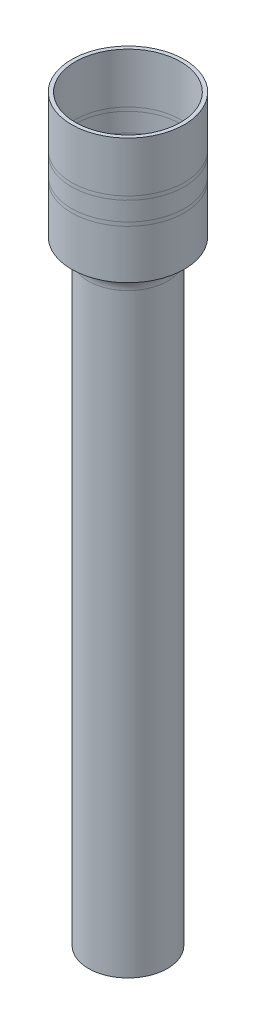
ISO-10303-21;
HEADER;
FILE_DESCRIPTION(('STEP AP214'),'2;1');
FILE_NAME('part.step','',(''),(''),'','','');
FILE_SCHEMA(('AUTOMOTIVE_DESIGN { 1 0 10303 214 1 1 1 1 }'));
ENDSEC;
DATA;
#1=APPLICATION_CONTEXT('core data for automotive mechanical design processes');
#2=APPLICATION_PROTOCOL_DEFINITION('international standard','automotive_design',2000,#1);
#3=PRODUCT_CONTEXT('',#1,'mechanical');
#4=PRODUCT('Part','Part','',(#3));
#5=PRODUCT_RELATED_PRODUCT_CATEGORY('part','',(#4));
#6=PRODUCT_DEFINITION_FORMATION('','',#4);
#7=PRODUCT_DEFINITION_CONTEXT('part definition',#1,'design');
#8=PRODUCT_DEFINITION('design','',#6,#7);
#9=PRODUCT_DEFINITION_SHAPE('','',#8);
#10=(LENGTH_UNIT() NAMED_UNIT(*) SI_UNIT(.MILLI.,.METRE.));
#11=(NAMED_UNIT(*) PLANE_ANGLE_UNIT() SI_UNIT($,.RADIAN.));
#12=(NAMED_UNIT(*) SI_UNIT($,.STERADIAN.) SOLID_ANGLE_UNIT());
#13=UNCERTAINTY_MEASURE_WITH_UNIT(LENGTH_MEASURE(1.E-05),#10,'distance_accuracy_value','');
#14=(GEOMETRIC_REPRESENTATION_CONTEXT(3) GLOBAL_UNCERTAINTY_ASSIGNED_CONTEXT((#13)) GLOBAL_UNIT_ASSIGNED_CONTEXT((#10,
#11,#12)) REPRESENTATION_CONTEXT('',''));
#15=CARTESIAN_POINT('',(0.,0.,0.));
#16=DIRECTION('',(0.,0.,1.));
#17=DIRECTION('',(1.,0.,0.));
#18=AXIS2_PLACEMENT_3D('',#15,#16,#17);
#19=CARTESIAN_POINT('',(0.,413.440248913902,0.));
#20=DIRECTION('',(0.,1.,0.));
#21=DIRECTION('',(0.,0.,1.));
#22=AXIS2_PLACEMENT_3D('',#19,#20,#21);
#23=PLANE('',#22);
#24=CARTESIAN_POINT('',(0.,413.440248913902,0.));
#25=DIRECTION('',(0.,1.,0.));
#26=DIRECTION('',(0.,0.,1.));
#27=AXIS2_PLACEMENT_3D('',#24,#25,#26);
#28=CIRCLE('',#27,45.);
#29=CARTESIAN_POINT('',(0.,413.440248913902,45.));
#30=VERTEX_POINT('',#29);
#31=EDGE_CURVE('E64',#30,#30,#28,.T.);
#32=ORIENTED_EDGE('',*,*,#31,.T.);
#33=EDGE_LOOP('',(#32));
#34=FACE_BOUND('',#33,.T.);
#35=CARTESIAN_POINT('',(0.,413.440248913902,0.));
#36=DIRECTION('',(0.,1.,0.));
#37=DIRECTION('',(0.,0.,1.));
#38=AXIS2_PLACEMENT_3D('',#35,#36,#37);
#39=CIRCLE('',#38,42.);
#40=CARTESIAN_POINT('',(0.,413.440248913902,42.));
#41=VERTEX_POINT('',#40);
#42=EDGE_CURVE('E52',#41,#41,#39,.F.);
#43=ORIENTED_EDGE('',*,*,#42,.T.);
#44=EDGE_LOOP('',(#43));
#45=FACE_BOUND('',#44,.T.);
#46=ADVANCED_FACE('F48',(#34,#45),#23,.T.);
#47=CARTESIAN_POINT('',(0.,359.440248913902,0.));
#48=DIRECTION('',(0.,1.,0.));
#49=DIRECTION('',(0.,0.,1.));
#50=AXIS2_PLACEMENT_3D('',#47,#48,#49);
#51=PLANE('',#50);
#52=CARTESIAN_POINT('',(0.,359.440248913902,0.));
#53=DIRECTION('',(0.,1.,0.));
#54=DIRECTION('',(0.,0.,1.));
#55=AXIS2_PLACEMENT_3D('',#52,#53,#54);
#56=CIRCLE('',#55,28.5);
#57=CARTESIAN_POINT('',(0.,359.440248913902,28.5));
#58=VERTEX_POINT('',#57);
#59=EDGE_CURVE('E56',#58,#58,#56,.F.);
#60=ORIENTED_EDGE('',*,*,#59,.F.);
#61=EDGE_LOOP('',(#60));
#62=FACE_BOUND('',#61,.T.);
#63=CARTESIAN_POINT('',(0.,359.440248913902,0.));
#64=DIRECTION('',(0.,1.,0.));
#65=DIRECTION('',(0.,0.,1.));
#66=AXIS2_PLACEMENT_3D('',#63,#64,#65);
#67=CIRCLE('',#66,31.5000000000001);
#68=CARTESIAN_POINT('',(0.,359.440248913902,31.5000000000001));
#69=VERTEX_POINT('',#68);
#70=EDGE_CURVE('E12',#69,#69,#67,.T.);
#71=ORIENTED_EDGE('',*,*,#70,.F.);
#72=EDGE_LOOP('',(#71));
#73=FACE_BOUND('',#72,.T.);
#74=ADVANCED_FACE('F92',(#62,#73),#51,.F.);
#75=CARTESIAN_POINT('',(0.,507.176268760713,0.));
#76=DIRECTION('',(0.,1.,0.));
#77=DIRECTION('',(0.,0.,1.));
#78=AXIS2_PLACEMENT_3D('',#75,#76,#77);
#79=CYLINDRICAL_SURFACE('',#78,28.5);
#80=ORIENTED_EDGE('',*,*,#59,.T.);
#81=EDGE_LOOP('',(#80));
#82=FACE_BOUND('',#81,.T.);
#83=CARTESIAN_POINT('',(0.,362.515437357303,0.));
#84=DIRECTION('',(0.,1.,0.));
#85=DIRECTION('',(0.,0.,1.));
#86=AXIS2_PLACEMENT_3D('',#83,#84,#85);
#87=CIRCLE('',#86,28.5);
#88=CARTESIAN_POINT('',(0.,362.515437357303,28.5));
#89=VERTEX_POINT('',#88);
#90=EDGE_CURVE('E70',#89,#89,#87,.T.);
#91=ORIENTED_EDGE('',*,*,#90,.T.);
#92=EDGE_LOOP('',(#91));
#93=FACE_BOUND('',#92,.T.);
#94=ADVANCED_FACE('F87',(#82,#93),#79,.F.);
#95=CARTESIAN_POINT('',(0.,362.515437357303,0.));
#96=DIRECTION('',(0.,1.,0.));
#97=DIRECTION('',(0.,0.,1.));
#98=AXIS2_PLACEMENT_3D('',#95,#96,#97);
#99=TOROIDAL_SURFACE('',#98,43.5,15.);
#100=ORIENTED_EDGE('',*,*,#90,.F.);
#101=EDGE_LOOP('',(#100));
#102=FACE_BOUND('',#101,.T.);
#103=CARTESIAN_POINT('',(0.,377.440248913902,0.));
#104=DIRECTION('',(0.,1.,0.));
#105=DIRECTION('',(0.,0.,1.));
#106=AXIS2_PLACEMENT_3D('',#103,#104,#105);
#107=CIRCLE('',#106,42.);
#108=CARTESIAN_POINT('',(0.,377.440248913902,42.));
#109=VERTEX_POINT('',#108);
#110=EDGE_CURVE('E66',#109,#109,#107,.T.);
#111=ORIENTED_EDGE('',*,*,#110,.T.);
#112=EDGE_LOOP('',(#111));
#113=FACE_BOUND('',#112,.T.);
#114=ADVANCED_FACE('F79',(#102,#113),#99,.T.);
#115=CARTESIAN_POINT('',(0.,507.176268760713,0.));
#116=DIRECTION('',(0.,1.,0.));
#117=DIRECTION('',(0.,0.,1.));
#118=AXIS2_PLACEMENT_3D('',#115,#116,#117);
#119=CYLINDRICAL_SURFACE('',#118,42.);
#120=ORIENTED_EDGE('',*,*,#110,.F.);
#121=EDGE_LOOP('',(#120));
#122=FACE_BOUND('',#121,.T.);
#123=ORIENTED_EDGE('',*,*,#42,.F.);
#124=EDGE_LOOP('',(#123));
#125=FACE_BOUND('',#124,.T.);
#126=ADVANCED_FACE('F76',(#122,#125),#119,.F.);
#127=CARTESIAN_POINT('',(0.,507.176268760713,0.));
#128=DIRECTION('',(0.,1.,0.));
#129=DIRECTION('',(0.,0.,1.));
#130=AXIS2_PLACEMENT_3D('',#127,#128,#129);
#131=CYLINDRICAL_SURFACE('',#130,31.5000000000001);
#132=ORIENTED_EDGE('',*,*,#70,.T.);
#133=EDGE_LOOP('',(#132));
#134=FACE_BOUND('',#133,.T.);
#135=CARTESIAN_POINT('',(0.,359.515437357303,0.));
#136=DIRECTION('',(0.,1.,0.));
#137=DIRECTION('',(0.,0.,1.));
#138=AXIS2_PLACEMENT_3D('',#135,#136,#137);
#139=CIRCLE('',#138,31.5);
#140=CARTESIAN_POINT('',(0.,359.515437357303,31.5));
#141=VERTEX_POINT('',#140);
#142=EDGE_CURVE('E116',#141,#141,#139,.T.);
#143=ORIENTED_EDGE('',*,*,#142,.F.);
#144=EDGE_LOOP('',(#143));
#145=FACE_BOUND('',#144,.T.);
#146=ADVANCED_FACE('F78',(#134,#145),#131,.T.);
#147=CARTESIAN_POINT('',(0.,359.515437357303,0.));
#148=DIRECTION('',(0.,1.,0.));
#149=DIRECTION('',(0.,0.,1.));
#150=AXIS2_PLACEMENT_3D('',#147,#148,#149);
#151=TOROIDAL_SURFACE('',#150,46.5,15.);
#152=CARTESIAN_POINT('',(0.,374.440248913902,0.));
#153=DIRECTION('',(0.,1.,0.));
#154=DIRECTION('',(0.,0.,1.));
#155=AXIS2_PLACEMENT_3D('',#152,#153,#154);
#156=CIRCLE('',#155,45.);
#157=CARTESIAN_POINT('',(0.,374.440248913902,45.));
#158=VERTEX_POINT('',#157);
#159=EDGE_CURVE('E61',#158,#158,#156,.T.);
#160=ORIENTED_EDGE('',*,*,#159,.F.);
#161=EDGE_LOOP('',(#160));
#162=FACE_BOUND('',#161,.T.);
#163=ORIENTED_EDGE('',*,*,#142,.T.);
#164=EDGE_LOOP('',(#163));
#165=FACE_BOUND('',#164,.T.);
#166=ADVANCED_FACE('F85',(#162,#165),#151,.F.);
#167=CARTESIAN_POINT('',(0.,507.176268760713,0.));
#168=DIRECTION('',(0.,1.,0.));
#169=DIRECTION('',(0.,0.,1.));
#170=AXIS2_PLACEMENT_3D('',#167,#168,#169);
#171=CYLINDRICAL_SURFACE('',#170,45.);
#172=ORIENTED_EDGE('',*,*,#159,.T.);
#173=EDGE_LOOP('',(#172));
#174=FACE_BOUND('',#173,.T.);
#175=ORIENTED_EDGE('',*,*,#31,.F.);
#176=EDGE_LOOP('',(#175));
#177=FACE_BOUND('',#176,.T.);
#178=ADVANCED_FACE('F50',(#174,#177),#171,.T.);
#179=CLOSED_SHELL('',(#46,#74,#94,#114,#126,#146,#166,#178));
#180=MANIFOLD_SOLID_BREP('B2',#179);
#181=CARTESIAN_POINT('',(0.,416.440248913902,0.));
#182=DIRECTION('',(0.,1.,0.));
#183=DIRECTION('',(0.,0.,1.));
#184=AXIS2_PLACEMENT_3D('',#181,#182,#183);
#185=PLANE('',#184);
#186=CARTESIAN_POINT('',(0.,416.440248913902,0.));
#187=DIRECTION('',(0.,1.,0.));
#188=DIRECTION('',(0.,0.,1.));
#189=AXIS2_PLACEMENT_3D('',#186,#187,#188);
#190=CIRCLE('',#189,42.);
#191=CARTESIAN_POINT('',(0.,416.440248913902,42.));
#192=VERTEX_POINT('',#191);
#193=EDGE_CURVE('E190',#192,#192,#190,.F.);
#194=ORIENTED_EDGE('',*,*,#193,.F.);
#195=EDGE_LOOP('',(#194));
#196=FACE_BOUND('',#195,.T.);
#197=CARTESIAN_POINT('',(0.,416.440248913902,0.));
#198=DIRECTION('',(0.,1.,0.));
#199=DIRECTION('',(0.,0.,1.));
#200=AXIS2_PLACEMENT_3D('',#197,#198,#199);
#201=CIRCLE('',#200,45.);
#202=CARTESIAN_POINT('',(0.,416.440248913902,45.));
#203=VERTEX_POINT('',#202);
#204=EDGE_CURVE('E181',#203,#203,#201,.T.);
#205=ORIENTED_EDGE('',*,*,#204,.F.);
#206=EDGE_LOOP('',(#205));
#207=FACE_BOUND('',#206,.T.);
#208=ADVANCED_FACE('F177',(#196,#207),#185,.F.);
#209=CARTESIAN_POINT('',(0.,431.440248913902,0.));
#210=DIRECTION('',(0.,1.,0.));
#211=DIRECTION('',(0.,0.,1.));
#212=AXIS2_PLACEMENT_3D('',#209,#210,#211);
#213=PLANE('',#212);
#214=CARTESIAN_POINT('',(0.,431.440248913902,0.));
#215=DIRECTION('',(0.,1.,0.));
#216=DIRECTION('',(0.,0.,1.));
#217=AXIS2_PLACEMENT_3D('',#214,#215,#216);
#218=CIRCLE('',#217,42.);
#219=CARTESIAN_POINT('',(0.,431.440248913902,42.));
#220=VERTEX_POINT('',#219);
#221=EDGE_CURVE('E185',#220,#220,#218,.F.);
#222=ORIENTED_EDGE('',*,*,#221,.T.);
#223=EDGE_LOOP('',(#222));
#224=FACE_BOUND('',#223,.T.);
#225=CARTESIAN_POINT('',(0.,431.440248913902,0.));
#226=DIRECTION('',(0.,1.,0.));
#227=DIRECTION('',(0.,0.,1.));
#228=AXIS2_PLACEMENT_3D('',#225,#226,#227);
#229=CIRCLE('',#228,45.);
#230=CARTESIAN_POINT('',(0.,431.440248913902,45.));
#231=VERTEX_POINT('',#230);
#232=EDGE_CURVE('E47',#231,#231,#229,.T.);
#233=ORIENTED_EDGE('',*,*,#232,.T.);
#234=EDGE_LOOP('',(#233));
#235=FACE_BOUND('',#234,.T.);
#236=ADVANCED_FACE('F201',(#224,#235),#213,.T.);
#237=CARTESIAN_POINT('',(0.,507.176268760713,0.));
#238=DIRECTION('',(0.,1.,0.));
#239=DIRECTION('',(0.,0.,1.));
#240=AXIS2_PLACEMENT_3D('',#237,#238,#239);
#241=CYLINDRICAL_SURFACE('',#240,42.);
#242=ORIENTED_EDGE('',*,*,#193,.T.);
#243=EDGE_LOOP('',(#242));
#244=FACE_BOUND('',#243,.T.);
#245=ORIENTED_EDGE('',*,*,#221,.F.);
#246=EDGE_LOOP('',(#245));
#247=FACE_BOUND('',#246,.T.);
#248=ADVANCED_FACE('F207',(#244,#247),#241,.F.);
#249=CARTESIAN_POINT('',(0.,507.176268760713,0.));
#250=DIRECTION('',(0.,1.,0.));
#251=DIRECTION('',(0.,0.,1.));
#252=AXIS2_PLACEMENT_3D('',#249,#250,#251);
#253=CYLINDRICAL_SURFACE('',#252,45.);
#254=ORIENTED_EDGE('',*,*,#204,.T.);
#255=EDGE_LOOP('',(#254));
#256=FACE_BOUND('',#255,.T.);
#257=ORIENTED_EDGE('',*,*,#232,.F.);
#258=EDGE_LOOP('',(#257));
#259=FACE_BOUND('',#258,.T.);
#260=ADVANCED_FACE('F179',(#256,#259),#253,.T.);
#261=CLOSED_SHELL('',(#208,#236,#248,#260));
#262=MANIFOLD_SOLID_BREP('B7',#261);
#263=CARTESIAN_POINT('',(0.,413.440248913902,0.));
#264=DIRECTION('',(0.,1.,0.));
#265=DIRECTION('',(0.,0.,1.));
#266=AXIS2_PLACEMENT_3D('',#263,#264,#265);
#267=PLANE('',#266);
#268=CARTESIAN_POINT('',(0.,413.440248913902,0.));
#269=DIRECTION('',(0.,1.,0.));
#270=DIRECTION('',(0.,0.,1.));
#271=AXIS2_PLACEMENT_3D('',#268,#269,#270);
#272=CIRCLE('',#271,42.);
#273=CARTESIAN_POINT('',(0.,413.440248913902,42.));
#274=VERTEX_POINT('',#273);
#275=EDGE_CURVE('E259',#274,#274,#272,.F.);
#276=ORIENTED_EDGE('',*,*,#275,.F.);
#277=EDGE_LOOP('',(#276));
#278=FACE_BOUND('',#277,.T.);
#279=CARTESIAN_POINT('',(0.,413.440248913902,0.));
#280=DIRECTION('',(0.,1.,0.));
#281=DIRECTION('',(0.,0.,1.));
#282=AXIS2_PLACEMENT_3D('',#279,#280,#281);
#283=CIRCLE('',#282,45.);
#284=CARTESIAN_POINT('',(0.,413.440248913902,45.));
#285=VERTEX_POINT('',#284);
#286=EDGE_CURVE('E257',#285,#285,#283,.T.);
#287=ORIENTED_EDGE('',*,*,#286,.F.);
#288=EDGE_LOOP('',(#287));
#289=FACE_BOUND('',#288,.T.);
#290=ADVANCED_FACE('F246',(#278,#289),#267,.F.);
#291=CARTESIAN_POINT('',(0.,416.440248913902,0.));
#292=DIRECTION('',(0.,1.,0.));
#293=DIRECTION('',(0.,0.,1.));
#294=AXIS2_PLACEMENT_3D('',#291,#292,#293);
#295=PLANE('',#294);
#296=CARTESIAN_POINT('',(0.,416.440248913902,0.));
#297=DIRECTION('',(0.,1.,0.));
#298=DIRECTION('',(0.,0.,1.));
#299=AXIS2_PLACEMENT_3D('',#296,#297,#298);
#300=CIRCLE('',#299,45.);
#301=CARTESIAN_POINT('',(0.,416.440248913902,45.));
#302=VERTEX_POINT('',#301);
#303=EDGE_CURVE('E249',#302,#302,#300,.T.);
#304=ORIENTED_EDGE('',*,*,#303,.T.);
#305=EDGE_LOOP('',(#304));
#306=FACE_BOUND('',#305,.T.);
#307=CARTESIAN_POINT('',(0.,416.440248913902,0.));
#308=DIRECTION('',(0.,1.,0.));
#309=DIRECTION('',(0.,0.,1.));
#310=AXIS2_PLACEMENT_3D('',#307,#308,#309);
#311=CIRCLE('',#310,42.);
#312=CARTESIAN_POINT('',(0.,416.440248913902,42.));
#313=VERTEX_POINT('',#312);
#314=EDGE_CURVE('E176',#313,#313,#311,.F.);
#315=ORIENTED_EDGE('',*,*,#314,.T.);
#316=EDGE_LOOP('',(#315));
#317=FACE_BOUND('',#316,.T.);
#318=ADVANCED_FACE('F271',(#306,#317),#295,.T.);
#319=CARTESIAN_POINT('',(0.,507.176268760713,0.));
#320=DIRECTION('',(0.,1.,0.));
#321=DIRECTION('',(0.,0.,1.));
#322=AXIS2_PLACEMENT_3D('',#319,#320,#321);
#323=CYLINDRICAL_SURFACE('',#322,42.);
#324=ORIENTED_EDGE('',*,*,#275,.T.);
#325=EDGE_LOOP('',(#324));
#326=FACE_BOUND('',#325,.T.);
#327=ORIENTED_EDGE('',*,*,#314,.F.);
#328=EDGE_LOOP('',(#327));
#329=FACE_BOUND('',#328,.T.);
#330=ADVANCED_FACE('F266',(#326,#329),#323,.F.);
#331=CARTESIAN_POINT('',(0.,507.176268760713,0.));
#332=DIRECTION('',(0.,1.,0.));
#333=DIRECTION('',(0.,0.,1.));
#334=AXIS2_PLACEMENT_3D('',#331,#332,#333);
#335=CYLINDRICAL_SURFACE('',#334,45.);
#336=ORIENTED_EDGE('',*,*,#286,.T.);
#337=EDGE_LOOP('',(#336));
#338=FACE_BOUND('',#337,.T.);
#339=ORIENTED_EDGE('',*,*,#303,.F.);
#340=EDGE_LOOP('',(#339));
#341=FACE_BOUND('',#340,.T.);
#342=ADVANCED_FACE('F276',(#338,#341),#335,.T.);
#343=CLOSED_SHELL('',(#290,#318,#330,#342));
#344=MANIFOLD_SOLID_BREP('B42',#343);
#345=CARTESIAN_POINT('',(0.,434.440248913902,0.));
#346=DIRECTION('',(0.,1.,0.));
#347=DIRECTION('',(0.,0.,1.));
#348=AXIS2_PLACEMENT_3D('',#345,#346,#347);
#349=PLANE('',#348);
#350=CARTESIAN_POINT('',(0.,434.440248913902,0.));
#351=DIRECTION('',(0.,1.,0.));
#352=DIRECTION('',(0.,0.,1.));
#353=AXIS2_PLACEMENT_3D('',#350,#351,#352);
#354=CIRCLE('',#353,45.);
#355=CARTESIAN_POINT('',(0.,434.440248913902,45.));
#356=VERTEX_POINT('',#355);
#357=EDGE_CURVE('E328',#356,#356,#354,.T.);
#358=ORIENTED_EDGE('',*,*,#357,.F.);
#359=EDGE_LOOP('',(#358));
#360=FACE_BOUND('',#359,.T.);
#361=CARTESIAN_POINT('',(0.,434.440248913902,0.));
#362=DIRECTION('',(0.,1.,0.));
#363=DIRECTION('',(0.,0.,1.));
#364=AXIS2_PLACEMENT_3D('',#361,#362,#363);
#365=CIRCLE('',#364,42.);
#366=CARTESIAN_POINT('',(0.,434.440248913902,42.));
#367=VERTEX_POINT('',#366);
#368=EDGE_CURVE('E319',#367,#367,#365,.F.);
#369=ORIENTED_EDGE('',*,*,#368,.F.);
#370=EDGE_LOOP('',(#369));
#371=FACE_BOUND('',#370,.T.);
#372=ADVANCED_FACE('F315',(#360,#371),#349,.F.);
#373=CARTESIAN_POINT('',(42.,474.440248913902,0.));
#374=DIRECTION('',(0.,-1.,0.));
#375=DIRECTION('',(0.,0.,-1.));
#376=AXIS2_PLACEMENT_3D('',#373,#374,#375);
#377=PLANE('',#376);
#378=CARTESIAN_POINT('',(0.,474.440248913902,0.));
#379=DIRECTION('',(0.,1.,0.));
#380=DIRECTION('',(0.,0.,1.));
#381=AXIS2_PLACEMENT_3D('',#378,#379,#380);
#382=CIRCLE('',#381,42.);
#383=CARTESIAN_POINT('',(0.,474.440248913902,42.));
#384=VERTEX_POINT('',#383);
#385=EDGE_CURVE('E245',#384,#384,#382,.T.);
#386=ORIENTED_EDGE('',*,*,#385,.F.);
#387=EDGE_LOOP('',(#386));
#388=FACE_BOUND('',#387,.T.);
#389=CARTESIAN_POINT('',(0.,474.440248913902,0.));
#390=DIRECTION('',(0.,1.,0.));
#391=DIRECTION('',(0.,0.,1.));
#392=AXIS2_PLACEMENT_3D('',#389,#390,#391);
#393=CIRCLE('',#392,45.);
#394=CARTESIAN_POINT('',(0.,474.440248913902,45.));
#395=VERTEX_POINT('',#394);
#396=EDGE_CURVE('E323',#395,#395,#393,.T.);
#397=ORIENTED_EDGE('',*,*,#396,.T.);
#398=EDGE_LOOP('',(#397));
#399=FACE_BOUND('',#398,.T.);
#400=ADVANCED_FACE('F338',(#388,#399),#377,.F.);
#401=CARTESIAN_POINT('',(0.,507.176268760713,0.));
#402=DIRECTION('',(0.,1.,0.));
#403=DIRECTION('',(0.,0.,1.));
#404=AXIS2_PLACEMENT_3D('',#401,#402,#403);
#405=CYLINDRICAL_SURFACE('',#404,45.);
#406=ORIENTED_EDGE('',*,*,#357,.T.);
#407=EDGE_LOOP('',(#406));
#408=FACE_BOUND('',#407,.T.);
#409=ORIENTED_EDGE('',*,*,#396,.F.);
#410=EDGE_LOOP('',(#409));
#411=FACE_BOUND('',#410,.T.);
#412=ADVANCED_FACE('F344',(#408,#411),#405,.T.);
#413=CARTESIAN_POINT('',(0.,507.176268760713,0.));
#414=DIRECTION('',(0.,1.,0.));
#415=DIRECTION('',(0.,0.,1.));
#416=AXIS2_PLACEMENT_3D('',#413,#414,#415);
#417=CYLINDRICAL_SURFACE('',#416,42.);
#418=ORIENTED_EDGE('',*,*,#368,.T.);
#419=EDGE_LOOP('',(#418));
#420=FACE_BOUND('',#419,.T.);
#421=ORIENTED_EDGE('',*,*,#385,.T.);
#422=EDGE_LOOP('',(#421));
#423=FACE_BOUND('',#422,.T.);
#424=ADVANCED_FACE('F317',(#420,#423),#417,.F.);
#425=CLOSED_SHELL('',(#372,#400,#412,#424));
#426=MANIFOLD_SOLID_BREP('B171',#425);
#427=CARTESIAN_POINT('',(0.,431.440248913902,0.));
#428=DIRECTION('',(0.,1.,0.));
#429=DIRECTION('',(0.,0.,1.));
#430=AXIS2_PLACEMENT_3D('',#427,#428,#429);
#431=PLANE('',#430);
#432=CARTESIAN_POINT('',(0.,431.440248913902,0.));
#433=DIRECTION('',(0.,1.,0.));
#434=DIRECTION('',(0.,0.,1.));
#435=AXIS2_PLACEMENT_3D('',#432,#433,#434);
#436=CIRCLE('',#435,45.);
#437=CARTESIAN_POINT('',(0.,431.440248913902,45.));
#438=VERTEX_POINT('',#437);
#439=EDGE_CURVE('E396',#438,#438,#436,.T.);
#440=ORIENTED_EDGE('',*,*,#439,.F.);
#441=EDGE_LOOP('',(#440));
#442=FACE_BOUND('',#441,.T.);
#443=CARTESIAN_POINT('',(0.,431.440248913902,0.));
#444=DIRECTION('',(0.,1.,0.));
#445=DIRECTION('',(0.,0.,1.));
#446=AXIS2_PLACEMENT_3D('',#443,#444,#445);
#447=CIRCLE('',#446,42.);
#448=CARTESIAN_POINT('',(0.,431.440248913902,42.));
#449=VERTEX_POINT('',#448);
#450=EDGE_CURVE('E394',#449,#449,#447,.F.);
#451=ORIENTED_EDGE('',*,*,#450,.F.);
#452=EDGE_LOOP('',(#451));
#453=FACE_BOUND('',#452,.T.);
#454=ADVANCED_FACE('F383',(#442,#453),#431,.F.);
#455=CARTESIAN_POINT('',(0.,434.440248913902,0.));
#456=DIRECTION('',(0.,1.,0.));
#457=DIRECTION('',(0.,0.,1.));
#458=AXIS2_PLACEMENT_3D('',#455,#456,#457);
#459=PLANE('',#458);
#460=CARTESIAN_POINT('',(0.,434.440248913902,0.));
#461=DIRECTION('',(0.,1.,0.));
#462=DIRECTION('',(0.,0.,1.));
#463=AXIS2_PLACEMENT_3D('',#460,#461,#462);
#464=CIRCLE('',#463,42.);
#465=CARTESIAN_POINT('',(0.,434.440248913902,42.));
#466=VERTEX_POINT('',#465);
#467=EDGE_CURVE('E386',#466,#466,#464,.F.);
#468=ORIENTED_EDGE('',*,*,#467,.T.);
#469=EDGE_LOOP('',(#468));
#470=FACE_BOUND('',#469,.T.);
#471=CARTESIAN_POINT('',(0.,434.440248913902,0.));
#472=DIRECTION('',(0.,1.,0.));
#473=DIRECTION('',(0.,0.,1.));
#474=AXIS2_PLACEMENT_3D('',#471,#472,#473);
#475=CIRCLE('',#474,45.);
#476=CARTESIAN_POINT('',(0.,434.440248913902,45.));
#477=VERTEX_POINT('',#476);
#478=EDGE_CURVE('E314',#477,#477,#475,.T.);
#479=ORIENTED_EDGE('',*,*,#478,.T.);
#480=EDGE_LOOP('',(#479));
#481=FACE_BOUND('',#480,.T.);
#482=ADVANCED_FACE('F408',(#470,#481),#459,.T.);
#483=CARTESIAN_POINT('',(0.,507.176268760713,0.));
#484=DIRECTION('',(0.,1.,0.));
#485=DIRECTION('',(0.,0.,1.));
#486=AXIS2_PLACEMENT_3D('',#483,#484,#485);
#487=CYLINDRICAL_SURFACE('',#486,45.);
#488=ORIENTED_EDGE('',*,*,#439,.T.);
#489=EDGE_LOOP('',(#488));
#490=FACE_BOUND('',#489,.T.);
#491=ORIENTED_EDGE('',*,*,#478,.F.);
#492=EDGE_LOOP('',(#491));
#493=FACE_BOUND('',#492,.T.);
#494=ADVANCED_FACE('F403',(#490,#493),#487,.T.);
#495=CARTESIAN_POINT('',(0.,507.176268760713,0.));
#496=DIRECTION('',(0.,1.,0.));
#497=DIRECTION('',(0.,0.,1.));
#498=AXIS2_PLACEMENT_3D('',#495,#496,#497);
#499=CYLINDRICAL_SURFACE('',#498,42.);
#500=ORIENTED_EDGE('',*,*,#450,.T.);
#501=EDGE_LOOP('',(#500));
#502=FACE_BOUND('',#501,.T.);
#503=ORIENTED_EDGE('',*,*,#467,.F.);
#504=EDGE_LOOP('',(#503));
#505=FACE_BOUND('',#504,.T.);
#506=ADVANCED_FACE('F413',(#502,#505),#499,.F.);
#507=CLOSED_SHELL('',(#454,#482,#494,#506));
#508=MANIFOLD_SOLID_BREP('B240',#507);
#509=CARTESIAN_POINT('',(0.,359.440248913902,0.));
#510=DIRECTION('',(0.,1.,0.));
#511=DIRECTION('',(0.,0.,1.));
#512=AXIS2_PLACEMENT_3D('',#509,#510,#511);
#513=PLANE('',#512);
#514=CARTESIAN_POINT('',(0.,359.440248913902,0.));
#515=DIRECTION('',(0.,1.,0.));
#516=DIRECTION('',(0.,0.,1.));
#517=AXIS2_PLACEMENT_3D('',#514,#515,#516);
#518=CIRCLE('',#517,31.5000000000001);
#519=CARTESIAN_POINT('',(0.,359.440248913902,31.5000000000001));
#520=VERTEX_POINT('',#519);
#521=EDGE_CURVE('E457',#520,#520,#518,.T.);
#522=ORIENTED_EDGE('',*,*,#521,.T.);
#523=EDGE_LOOP('',(#522));
#524=FACE_BOUND('',#523,.T.);
#525=CARTESIAN_POINT('',(0.,359.440248913902,0.));
#526=DIRECTION('',(0.,1.,0.));
#527=DIRECTION('',(0.,0.,1.));
#528=AXIS2_PLACEMENT_3D('',#525,#526,#527);
#529=CIRCLE('',#528,28.5);
#530=CARTESIAN_POINT('',(0.,359.440248913902,28.5));
#531=VERTEX_POINT('',#530);
#532=EDGE_CURVE('E448',#531,#531,#529,.F.);
#533=ORIENTED_EDGE('',*,*,#532,.T.);
#534=EDGE_LOOP('',(#533));
#535=FACE_BOUND('',#534,.T.);
#536=ADVANCED_FACE('F444',(#524,#535),#513,.T.);
#537=CARTESIAN_POINT('',(0.,507.176268760713,0.));
#538=DIRECTION('',(0.,1.,0.));
#539=DIRECTION('',(0.,0.,1.));
#540=AXIS2_PLACEMENT_3D('',#537,#538,#539);
#541=CYLINDRICAL_SURFACE('',#540,31.5000000000001);
#542=CARTESIAN_POINT('',(0.,-115.559751086098,0.));
#543=DIRECTION('',(0.,1.,0.));
#544=DIRECTION('',(0.,0.,1.));
#545=AXIS2_PLACEMENT_3D('',#542,#543,#544);
#546=CIRCLE('',#545,31.5000000000001);
#547=CARTESIAN_POINT('',(0.,-115.559751086098,31.5000000000001));
#548=VERTEX_POINT('',#547);
#549=EDGE_CURVE('E452',#548,#548,#546,.T.);
#550=ORIENTED_EDGE('',*,*,#549,.T.);
#551=EDGE_LOOP('',(#550));
#552=FACE_BOUND('',#551,.T.);
#553=ORIENTED_EDGE('',*,*,#521,.F.);
#554=EDGE_LOOP('',(#553));
#555=FACE_BOUND('',#554,.T.);
#556=ADVANCED_FACE('F446',(#552,#555),#541,.T.);
#557=CARTESIAN_POINT('',(0.,507.176268760713,0.));
#558=DIRECTION('',(0.,1.,0.));
#559=DIRECTION('',(0.,0.,1.));
#560=AXIS2_PLACEMENT_3D('',#557,#558,#559);
#561=CYLINDRICAL_SURFACE('',#560,28.5);
#562=CARTESIAN_POINT('',(0.,-115.559751086098,0.));
#563=DIRECTION('',(0.,1.,0.));
#564=DIRECTION('',(0.,0.,1.));
#565=AXIS2_PLACEMENT_3D('',#562,#563,#564);
#566=CIRCLE('',#565,28.5000000000001);
#567=CARTESIAN_POINT('',(0.,-115.559751086098,28.5000000000001));
#568=VERTEX_POINT('',#567);
#569=EDGE_CURVE('E382',#568,#568,#566,.T.);
#570=ORIENTED_EDGE('',*,*,#569,.F.);
#571=EDGE_LOOP('',(#570));
#572=FACE_BOUND('',#571,.T.);
#573=ORIENTED_EDGE('',*,*,#532,.F.);
#574=EDGE_LOOP('',(#573));
#575=FACE_BOUND('',#574,.T.);
#576=ADVANCED_FACE('F466',(#572,#575),#561,.F.);
#577=CARTESIAN_POINT('',(28.5000000000001,-115.559751086098,0.));
#578=DIRECTION('',(0.,1.,0.));
#579=DIRECTION('',(0.,0.,1.));
#580=AXIS2_PLACEMENT_3D('',#577,#578,#579);
#581=PLANE('',#580);
#582=ORIENTED_EDGE('',*,*,#549,.F.);
#583=EDGE_LOOP('',(#582));
#584=FACE_BOUND('',#583,.T.);
#585=ORIENTED_EDGE('',*,*,#569,.T.);
#586=EDGE_LOOP('',(#585));
#587=FACE_BOUND('',#586,.T.);
#588=ADVANCED_FACE('F468',(#584,#587),#581,.F.);
#589=CLOSED_SHELL('',(#536,#556,#576,#588));
#590=MANIFOLD_SOLID_BREP('B309',#589);
#591=ADVANCED_BREP_SHAPE_REPRESENTATION('',(#18,#180,#262,#344,#426,#508,#590),#14);
#592=SHAPE_DEFINITION_REPRESENTATION(#9,#591);
ENDSEC;
END-ISO-10303-21;
